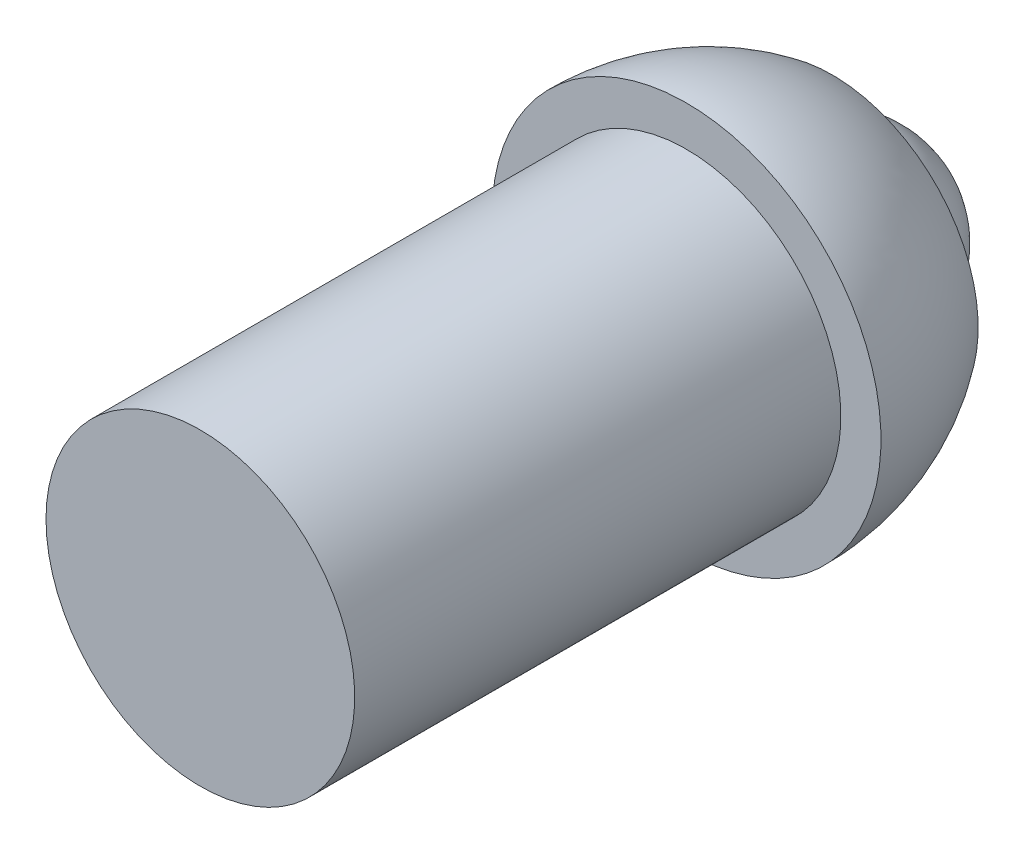
ISO-10303-21;
HEADER;
FILE_DESCRIPTION(('STEP AP214'),'2;1');
FILE_NAME('part.step','',(''),(''),'','','');
FILE_SCHEMA(('AUTOMOTIVE_DESIGN { 1 0 10303 214 1 1 1 1 }'));
ENDSEC;
DATA;
#1=APPLICATION_CONTEXT('core data for automotive mechanical design processes');
#2=APPLICATION_PROTOCOL_DEFINITION('international standard','automotive_design',2000,#1);
#3=PRODUCT_CONTEXT('',#1,'mechanical');
#4=PRODUCT('Part','Part','',(#3));
#5=PRODUCT_RELATED_PRODUCT_CATEGORY('part','',(#4));
#6=PRODUCT_DEFINITION_FORMATION('','',#4);
#7=PRODUCT_DEFINITION_CONTEXT('part definition',#1,'design');
#8=PRODUCT_DEFINITION('design','',#6,#7);
#9=PRODUCT_DEFINITION_SHAPE('','',#8);
#10=(LENGTH_UNIT() NAMED_UNIT(*) SI_UNIT(.MILLI.,.METRE.));
#11=(NAMED_UNIT(*) PLANE_ANGLE_UNIT() SI_UNIT($,.RADIAN.));
#12=(NAMED_UNIT(*) SI_UNIT($,.STERADIAN.) SOLID_ANGLE_UNIT());
#13=UNCERTAINTY_MEASURE_WITH_UNIT(LENGTH_MEASURE(1.E-05),#10,'distance_accuracy_value','');
#14=(GEOMETRIC_REPRESENTATION_CONTEXT(3) GLOBAL_UNCERTAINTY_ASSIGNED_CONTEXT((#13)) GLOBAL_UNIT_ASSIGNED_CONTEXT((#10,
#11,#12)) REPRESENTATION_CONTEXT('',''));
#15=CARTESIAN_POINT('',(0.,0.,0.));
#16=DIRECTION('',(0.,0.,1.));
#17=DIRECTION('',(1.,0.,0.));
#18=AXIS2_PLACEMENT_3D('',#15,#16,#17);
#19=CARTESIAN_POINT('',(0.,0.,10.));
#20=DIRECTION('',(0.,0.,-1.));
#21=DIRECTION('',(-1.,0.,0.));
#22=AXIS2_PLACEMENT_3D('',#19,#20,#21);
#23=PLANE('',#22);
#24=CARTESIAN_POINT('',(0.,0.,10.));
#25=DIRECTION('',(0.,0.,-1.));
#26=DIRECTION('',(-1.,0.,0.));
#27=AXIS2_PLACEMENT_3D('',#24,#25,#26);
#28=CIRCLE('',#27,3.175);
#29=CARTESIAN_POINT('',(-3.175,0.,10.));
#30=VERTEX_POINT('',#29);
#31=EDGE_CURVE('E10',#30,#30,#28,.T.);
#32=ORIENTED_EDGE('',*,*,#31,.F.);
#33=EDGE_LOOP('',(#32));
#34=FACE_BOUND('',#33,.T.);
#35=ADVANCED_FACE('F33',(#34),#23,.F.);
#36=CARTESIAN_POINT('',(0.,0.,-5.));
#37=DIRECTION('',(0.,0.,-1.));
#38=DIRECTION('',(-1.,0.,0.));
#39=AXIS2_PLACEMENT_3D('',#36,#37,#38);
#40=CYLINDRICAL_SURFACE('',#39,3.175);
#41=CARTESIAN_POINT('',(0.,0.,0.));
#42=DIRECTION('',(0.,0.,-1.));
#43=DIRECTION('',(-1.,0.,0.));
#44=AXIS2_PLACEMENT_3D('',#41,#42,#43);
#45=CIRCLE('',#44,3.175);
#46=CARTESIAN_POINT('',(-3.175,0.,0.));
#47=VERTEX_POINT('',#46);
#48=EDGE_CURVE('E39',#47,#47,#45,.T.);
#49=ORIENTED_EDGE('',*,*,#48,.F.);
#50=EDGE_LOOP('',(#49));
#51=FACE_BOUND('',#50,.T.);
#52=ORIENTED_EDGE('',*,*,#31,.T.);
#53=EDGE_LOOP('',(#52));
#54=FACE_BOUND('',#53,.T.);
#55=ADVANCED_FACE('F72',(#51,#54),#40,.T.);
#56=CARTESIAN_POINT('',(3.175,0.,0.));
#57=DIRECTION('',(0.,0.,-1.));
#58=DIRECTION('',(-1.,0.,0.));
#59=AXIS2_PLACEMENT_3D('',#56,#57,#58);
#60=PLANE('',#59);
#61=CARTESIAN_POINT('',(0.,0.,0.));
#62=DIRECTION('',(0.,0.,-1.));
#63=DIRECTION('',(-1.,0.,0.));
#64=AXIS2_PLACEMENT_3D('',#61,#62,#63);
#65=CIRCLE('',#64,4.);
#66=CARTESIAN_POINT('',(-4.,0.,0.));
#67=VERTEX_POINT('',#66);
#68=EDGE_CURVE('E43',#67,#67,#65,.T.);
#69=ORIENTED_EDGE('',*,*,#68,.F.);
#70=EDGE_LOOP('',(#69));
#71=FACE_BOUND('',#70,.T.);
#72=ORIENTED_EDGE('',*,*,#48,.T.);
#73=EDGE_LOOP('',(#72));
#74=FACE_BOUND('',#73,.T.);
#75=ADVANCED_FACE('F67',(#71,#74),#60,.F.);
#76=CARTESIAN_POINT('',(0.,0.,0.));
#77=DIRECTION('',(0.,0.,-1.));
#78=DIRECTION('',(-1.,0.,0.));
#79=AXIS2_PLACEMENT_3D('',#76,#77,#78);
#80=DEGENERATE_TOROIDAL_SURFACE('',#79,1.,5.,.F.);
#81=CARTESIAN_POINT('',(0.,0.,-3.));
#82=DIRECTION('',(0.,0.,-1.));
#83=DIRECTION('',(-1.,0.,0.));
#84=AXIS2_PLACEMENT_3D('',#81,#82,#83);
#85=CIRCLE('',#84,3.);
#86=CARTESIAN_POINT('',(-3.,0.,-3.));
#87=VERTEX_POINT('',#86);
#88=EDGE_CURVE('E47',#87,#87,#85,.T.);
#89=ORIENTED_EDGE('',*,*,#88,.F.);
#90=EDGE_LOOP('',(#89));
#91=FACE_BOUND('',#90,.T.);
#92=ORIENTED_EDGE('',*,*,#68,.T.);
#93=EDGE_LOOP('',(#92));
#94=FACE_BOUND('',#93,.T.);
#95=ADVANCED_FACE('F61',(#91,#94),#80,.F.);
#96=CARTESIAN_POINT('',(3.,0.,-3.));
#97=DIRECTION('',(0.,0.,1.));
#98=DIRECTION('',(1.,0.,0.));
#99=AXIS2_PLACEMENT_3D('',#96,#97,#98);
#100=PLANE('',#99);
#101=CARTESIAN_POINT('',(0.,0.,-3.));
#102=DIRECTION('',(0.,0.,-1.));
#103=DIRECTION('',(-1.,0.,0.));
#104=AXIS2_PLACEMENT_3D('',#101,#102,#103);
#105=CIRCLE('',#104,2.);
#106=CARTESIAN_POINT('',(-2.,0.,-3.));
#107=VERTEX_POINT('',#106);
#108=EDGE_CURVE('E52',#107,#107,#105,.T.);
#109=ORIENTED_EDGE('',*,*,#108,.F.);
#110=EDGE_LOOP('',(#109));
#111=FACE_BOUND('',#110,.T.);
#112=ORIENTED_EDGE('',*,*,#88,.T.);
#113=EDGE_LOOP('',(#112));
#114=FACE_BOUND('',#113,.T.);
#115=ADVANCED_FACE('F58',(#111,#114),#100,.F.);
#116=CARTESIAN_POINT('',(0.,0.,-3.));
#117=DIRECTION('',(0.,0.,-1.));
#118=DIRECTION('',(1.,0.,0.));
#119=AXIS2_PLACEMENT_3D('',#116,#117,#118);
#120=SPHERICAL_SURFACE('',#119,2.);
#121=ORIENTED_EDGE('',*,*,#108,.T.);
#122=EDGE_LOOP('',(#121));
#123=FACE_BOUND('',#122,.T.);
#124=ADVANCED_FACE('F56',(#123),#120,.T.);
#125=CLOSED_SHELL('',(#35,#55,#75,#95,#115,#124));
#126=MANIFOLD_SOLID_BREP('B2',#125);
#127=ADVANCED_BREP_SHAPE_REPRESENTATION('',(#18,#126),#14);
#128=SHAPE_DEFINITION_REPRESENTATION(#9,#127);
ENDSEC;
END-ISO-10303-21;
